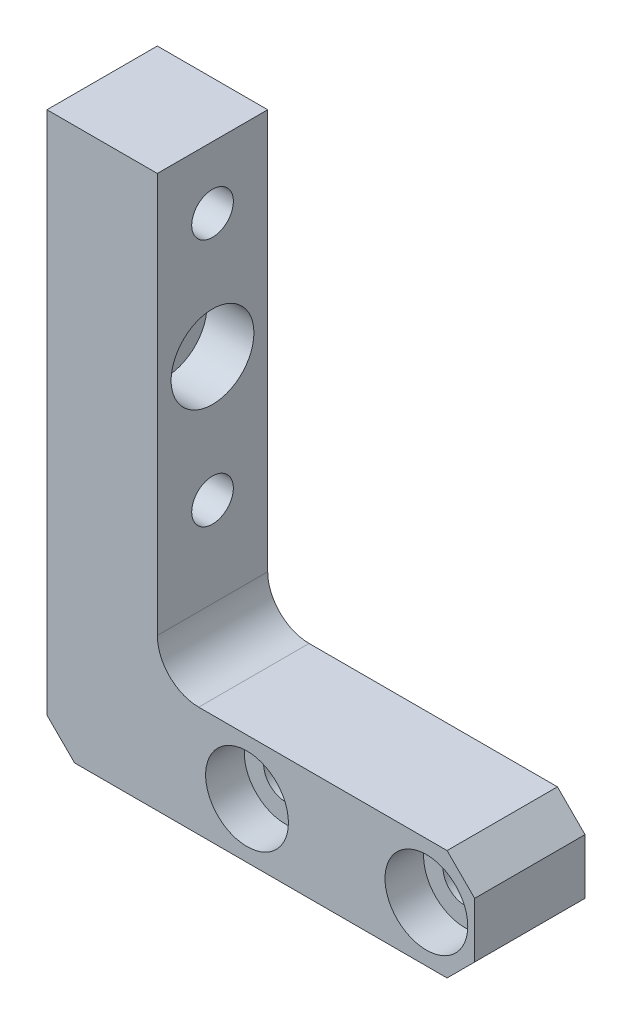
ISO-10303-21;
HEADER;
FILE_DESCRIPTION(('STEP AP214'),'2;1');
FILE_NAME('part.step','',(''),(''),'','','');
FILE_SCHEMA(('AUTOMOTIVE_DESIGN { 1 0 10303 214 1 1 1 1 }'));
ENDSEC;
DATA;
#1=APPLICATION_CONTEXT('core data for automotive mechanical design processes');
#2=APPLICATION_PROTOCOL_DEFINITION('international standard','automotive_design',2000,#1);
#3=PRODUCT_CONTEXT('',#1,'mechanical');
#4=PRODUCT('Part','Part','',(#3));
#5=PRODUCT_RELATED_PRODUCT_CATEGORY('part','',(#4));
#6=PRODUCT_DEFINITION_FORMATION('','',#4);
#7=PRODUCT_DEFINITION_CONTEXT('part definition',#1,'design');
#8=PRODUCT_DEFINITION('design','',#6,#7);
#9=PRODUCT_DEFINITION_SHAPE('','',#8);
#10=(LENGTH_UNIT() NAMED_UNIT(*) SI_UNIT(.MILLI.,.METRE.));
#11=(NAMED_UNIT(*) PLANE_ANGLE_UNIT() SI_UNIT($,.RADIAN.));
#12=(NAMED_UNIT(*) SI_UNIT($,.STERADIAN.) SOLID_ANGLE_UNIT());
#13=UNCERTAINTY_MEASURE_WITH_UNIT(LENGTH_MEASURE(1.E-05),#10,'distance_accuracy_value','');
#14=(GEOMETRIC_REPRESENTATION_CONTEXT(3) GLOBAL_UNCERTAINTY_ASSIGNED_CONTEXT((#13)) GLOBAL_UNIT_ASSIGNED_CONTEXT((#10,
#11,#12)) REPRESENTATION_CONTEXT('',''));
#15=CARTESIAN_POINT('',(0.,0.,0.));
#16=DIRECTION('',(0.,0.,1.));
#17=DIRECTION('',(1.,0.,0.));
#18=AXIS2_PLACEMENT_3D('',#15,#16,#17);
#19=CARTESIAN_POINT('',(-10.9,8.1,4.));
#20=DIRECTION('',(-1.,0.,0.));
#21=DIRECTION('',(0.,0.,1.));
#22=AXIS2_PLACEMENT_3D('',#19,#20,#21);
#23=PLANE('',#22);
#24=CARTESIAN_POINT('',(-10.9,6.49999999999999,4.));
#25=DIRECTION('',(1.,0.,0.));
#26=DIRECTION('',(0.,0.,-1.));
#27=AXIS2_PLACEMENT_3D('',#24,#25,#26);
#28=CIRCLE('',#27,3.);
#29=CARTESIAN_POINT('',(-10.9,6.49999999999999,1.));
#30=VERTEX_POINT('',#29);
#31=EDGE_CURVE('E195',#30,#30,#28,.T.);
#32=ORIENTED_EDGE('',*,*,#31,.T.);
#33=EDGE_LOOP('',(#32));
#34=FACE_BOUND('',#33,.T.);
#35=CARTESIAN_POINT('',(-10.9,6.49999999999999,4.));
#36=DIRECTION('',(1.,0.,0.));
#37=DIRECTION('',(0.,0.,-1.));
#38=AXIS2_PLACEMENT_3D('',#35,#36,#37);
#39=CIRCLE('',#38,1.6);
#40=CARTESIAN_POINT('',(-10.9,6.49999999999999,2.4));
#41=VERTEX_POINT('',#40);
#42=EDGE_CURVE('E192',#41,#41,#39,.F.);
#43=ORIENTED_EDGE('',*,*,#42,.T.);
#44=EDGE_LOOP('',(#43));
#45=FACE_BOUND('',#44,.T.);
#46=ADVANCED_FACE('F16',(#34,#45),#23,.F.);
#47=CARTESIAN_POINT('',(-1.,-16.,8.));
#48=DIRECTION('',(0.,0.,1.));
#49=DIRECTION('',(1.,0.,0.));
#50=AXIS2_PLACEMENT_3D('',#47,#48,#49);
#51=CYLINDRICAL_SURFACE('',#50,3.);
#52=CARTESIAN_POINT('',(-1.,-16.,8.));
#53=DIRECTION('',(0.,0.,1.));
#54=DIRECTION('',(1.,0.,0.));
#55=AXIS2_PLACEMENT_3D('',#52,#53,#54);
#56=CIRCLE('',#55,3.);
#57=CARTESIAN_POINT('',(2.,-16.,8.));
#58=VERTEX_POINT('',#57);
#59=EDGE_CURVE('E189',#58,#58,#56,.F.);
#60=ORIENTED_EDGE('',*,*,#59,.F.);
#61=EDGE_LOOP('',(#60));
#62=FACE_BOUND('',#61,.T.);
#63=CARTESIAN_POINT('',(-1.,-16.,5.2));
#64=DIRECTION('',(0.,0.,1.));
#65=DIRECTION('',(1.,0.,0.));
#66=AXIS2_PLACEMENT_3D('',#63,#64,#65);
#67=CIRCLE('',#66,3.);
#68=CARTESIAN_POINT('',(2.,-16.,5.2));
#69=VERTEX_POINT('',#68);
#70=EDGE_CURVE('E19',#69,#69,#67,.F.);
#71=ORIENTED_EDGE('',*,*,#70,.T.);
#72=EDGE_LOOP('',(#71));
#73=FACE_BOUND('',#72,.T.);
#74=ADVANCED_FACE('F204',(#62,#73),#51,.F.);
#75=CARTESIAN_POINT('',(12.,-16.,8.));
#76=DIRECTION('',(0.,0.,1.));
#77=DIRECTION('',(1.,0.,0.));
#78=AXIS2_PLACEMENT_3D('',#75,#76,#77);
#79=CYLINDRICAL_SURFACE('',#78,3.);
#80=CARTESIAN_POINT('',(12.,-16.,8.));
#81=DIRECTION('',(0.,0.,1.));
#82=DIRECTION('',(1.,0.,0.));
#83=AXIS2_PLACEMENT_3D('',#80,#81,#82);
#84=CIRCLE('',#83,3.);
#85=CARTESIAN_POINT('',(15.,-16.,8.));
#86=VERTEX_POINT('',#85);
#87=EDGE_CURVE('E186',#86,#86,#84,.F.);
#88=ORIENTED_EDGE('',*,*,#87,.F.);
#89=EDGE_LOOP('',(#88));
#90=FACE_BOUND('',#89,.T.);
#91=CARTESIAN_POINT('',(12.,-16.,5.2));
#92=DIRECTION('',(0.,0.,1.));
#93=DIRECTION('',(1.,0.,0.));
#94=AXIS2_PLACEMENT_3D('',#91,#92,#93);
#95=CIRCLE('',#94,3.);
#96=CARTESIAN_POINT('',(15.,-16.,5.2));
#97=VERTEX_POINT('',#96);
#98=EDGE_CURVE('E197',#97,#97,#95,.F.);
#99=ORIENTED_EDGE('',*,*,#98,.T.);
#100=EDGE_LOOP('',(#99));
#101=FACE_BOUND('',#100,.T.);
#102=ADVANCED_FACE('F210',(#90,#101),#79,.F.);
#103=CARTESIAN_POINT('',(0.600000000000003,-16.,5.2));
#104=DIRECTION('',(0.,0.,-1.));
#105=DIRECTION('',(-1.,0.,0.));
#106=AXIS2_PLACEMENT_3D('',#103,#104,#105);
#107=PLANE('',#106);
#108=ORIENTED_EDGE('',*,*,#70,.F.);
#109=EDGE_LOOP('',(#108));
#110=FACE_BOUND('',#109,.T.);
#111=CARTESIAN_POINT('',(-1.,-16.,5.2));
#112=DIRECTION('',(0.,0.,1.));
#113=DIRECTION('',(1.,0.,0.));
#114=AXIS2_PLACEMENT_3D('',#111,#112,#113);
#115=CIRCLE('',#114,1.6);
#116=CARTESIAN_POINT('',(0.599999999999999,-16.,5.2));
#117=VERTEX_POINT('',#116);
#118=EDGE_CURVE('E183',#117,#117,#115,.F.);
#119=ORIENTED_EDGE('',*,*,#118,.T.);
#120=EDGE_LOOP('',(#119));
#121=FACE_BOUND('',#120,.T.);
#122=ADVANCED_FACE('F206',(#110,#121),#107,.F.);
#123=CARTESIAN_POINT('',(13.6,-16.,5.2));
#124=DIRECTION('',(0.,0.,-1.));
#125=DIRECTION('',(-1.,0.,0.));
#126=AXIS2_PLACEMENT_3D('',#123,#124,#125);
#127=PLANE('',#126);
#128=ORIENTED_EDGE('',*,*,#98,.F.);
#129=EDGE_LOOP('',(#128));
#130=FACE_BOUND('',#129,.T.);
#131=CARTESIAN_POINT('',(12.,-16.,5.2));
#132=DIRECTION('',(0.,0.,1.));
#133=DIRECTION('',(1.,0.,0.));
#134=AXIS2_PLACEMENT_3D('',#131,#132,#133);
#135=CIRCLE('',#134,1.6);
#136=CARTESIAN_POINT('',(13.6,-16.,5.2));
#137=VERTEX_POINT('',#136);
#138=EDGE_CURVE('E101',#137,#137,#135,.F.);
#139=ORIENTED_EDGE('',*,*,#138,.T.);
#140=EDGE_LOOP('',(#139));
#141=FACE_BOUND('',#140,.T.);
#142=ADVANCED_FACE('F209',(#130,#141),#127,.F.);
#143=CARTESIAN_POINT('',(-7.5,6.49999999999999,4.));
#144=DIRECTION('',(1.,0.,0.));
#145=DIRECTION('',(0.,0.,-1.));
#146=AXIS2_PLACEMENT_3D('',#143,#144,#145);
#147=CYLINDRICAL_SURFACE('',#146,3.);
#148=ORIENTED_EDGE('',*,*,#31,.F.);
#149=EDGE_LOOP('',(#148));
#150=FACE_BOUND('',#149,.T.);
#151=CARTESIAN_POINT('',(-7.5,6.49999999999999,4.));
#152=DIRECTION('',(1.,0.,0.));
#153=DIRECTION('',(0.,0.,-1.));
#154=AXIS2_PLACEMENT_3D('',#151,#152,#153);
#155=CIRCLE('',#154,3.);
#156=CARTESIAN_POINT('',(-7.5,6.49999999999999,1.));
#157=VERTEX_POINT('',#156);
#158=EDGE_CURVE('E173',#157,#157,#155,.T.);
#159=ORIENTED_EDGE('',*,*,#158,.T.);
#160=EDGE_LOOP('',(#159));
#161=FACE_BOUND('',#160,.T.);
#162=ADVANCED_FACE('F382',(#150,#161),#147,.F.);
#163=CARTESIAN_POINT('',(-15.5,15.5,4.));
#164=DIRECTION('',(-1.,0.,0.));
#165=DIRECTION('',(0.,0.,1.));
#166=AXIS2_PLACEMENT_3D('',#163,#164,#165);
#167=CYLINDRICAL_SURFACE('',#166,1.51);
#168=CARTESIAN_POINT('',(-7.5,15.5,4.));
#169=DIRECTION('',(-1.,0.,0.));
#170=DIRECTION('',(0.,0.,1.));
#171=AXIS2_PLACEMENT_3D('',#168,#169,#170);
#172=CIRCLE('',#171,1.51);
#173=CARTESIAN_POINT('',(-7.5,15.5,5.51));
#174=VERTEX_POINT('',#173);
#175=EDGE_CURVE('E100',#174,#174,#172,.F.);
#176=ORIENTED_EDGE('',*,*,#175,.T.);
#177=EDGE_LOOP('',(#176));
#178=FACE_BOUND('',#177,.T.);
#179=CARTESIAN_POINT('',(-15.5,15.5,4.));
#180=DIRECTION('',(-1.,0.,0.));
#181=DIRECTION('',(0.,0.,1.));
#182=AXIS2_PLACEMENT_3D('',#179,#180,#181);
#183=CIRCLE('',#182,1.51);
#184=CARTESIAN_POINT('',(-15.5,15.5,5.51));
#185=VERTEX_POINT('',#184);
#186=EDGE_CURVE('E152',#185,#185,#183,.T.);
#187=ORIENTED_EDGE('',*,*,#186,.T.);
#188=EDGE_LOOP('',(#187));
#189=FACE_BOUND('',#188,.T.);
#190=ADVANCED_FACE('F373',(#178,#189),#167,.F.);
#191=CARTESIAN_POINT('',(-15.5,-2.5,4.));
#192=DIRECTION('',(-1.,0.,0.));
#193=DIRECTION('',(0.,0.,1.));
#194=AXIS2_PLACEMENT_3D('',#191,#192,#193);
#195=CYLINDRICAL_SURFACE('',#194,1.51);
#196=CARTESIAN_POINT('',(-7.5,-2.5,4.));
#197=DIRECTION('',(-1.,0.,0.));
#198=DIRECTION('',(0.,0.,1.));
#199=AXIS2_PLACEMENT_3D('',#196,#197,#198);
#200=CIRCLE('',#199,1.51);
#201=CARTESIAN_POINT('',(-7.5,-2.5,5.51));
#202=VERTEX_POINT('',#201);
#203=EDGE_CURVE('E176',#202,#202,#200,.F.);
#204=ORIENTED_EDGE('',*,*,#203,.T.);
#205=EDGE_LOOP('',(#204));
#206=FACE_BOUND('',#205,.T.);
#207=CARTESIAN_POINT('',(-15.5,-2.5,4.));
#208=DIRECTION('',(-1.,0.,0.));
#209=DIRECTION('',(0.,0.,1.));
#210=AXIS2_PLACEMENT_3D('',#207,#208,#209);
#211=CIRCLE('',#210,1.51);
#212=CARTESIAN_POINT('',(-15.5,-2.5,5.51));
#213=VERTEX_POINT('',#212);
#214=EDGE_CURVE('E168',#213,#213,#211,.T.);
#215=ORIENTED_EDGE('',*,*,#214,.T.);
#216=EDGE_LOOP('',(#215));
#217=FACE_BOUND('',#216,.T.);
#218=ADVANCED_FACE('F364',(#206,#217),#195,.F.);
#219=CARTESIAN_POINT('',(-7.5,6.49999999999999,4.));
#220=DIRECTION('',(1.,0.,0.));
#221=DIRECTION('',(0.,0.,-1.));
#222=AXIS2_PLACEMENT_3D('',#219,#220,#221);
#223=CYLINDRICAL_SURFACE('',#222,1.6);
#224=CARTESIAN_POINT('',(-15.5,6.49999999999999,4.));
#225=DIRECTION('',(1.,0.,0.));
#226=DIRECTION('',(0.,0.,-1.));
#227=AXIS2_PLACEMENT_3D('',#224,#225,#226);
#228=CIRCLE('',#227,1.6);
#229=CARTESIAN_POINT('',(-15.5,6.49999999999999,2.4));
#230=VERTEX_POINT('',#229);
#231=EDGE_CURVE('E165',#230,#230,#228,.F.);
#232=ORIENTED_EDGE('',*,*,#231,.T.);
#233=EDGE_LOOP('',(#232));
#234=FACE_BOUND('',#233,.T.);
#235=ORIENTED_EDGE('',*,*,#42,.F.);
#236=EDGE_LOOP('',(#235));
#237=FACE_BOUND('',#236,.T.);
#238=ADVANCED_FACE('F226',(#234,#237),#223,.F.);
#239=CARTESIAN_POINT('',(0.,0.,8.));
#240=DIRECTION('',(0.,0.,1.));
#241=DIRECTION('',(1.,0.,0.));
#242=AXIS2_PLACEMENT_3D('',#239,#240,#241);
#243=PLANE('',#242);
#244=DIRECTION('',(1.,0.,0.));
#245=VECTOR('',#244,1.);
#246=CARTESIAN_POINT('',(-15.5,-20.,8.));
#247=LINE('',#246,#245);
#248=CARTESIAN_POINT('',(-13.5,-20.,8.));
#249=VERTEX_POINT('',#248);
#250=CARTESIAN_POINT('',(13.5,-20.,8.));
#251=VERTEX_POINT('',#250);
#252=EDGE_CURVE('E135',#249,#251,#247,.T.);
#253=ORIENTED_EDGE('',*,*,#252,.T.);
#254=DIRECTION('',(-0.707106781186549,-0.707106781186546,0.));
#255=VECTOR('',#254,1.);
#256=CARTESIAN_POINT('',(15.5,-18.,8.));
#257=LINE('',#256,#255);
#258=CARTESIAN_POINT('',(15.5,-18.,8.));
#259=VERTEX_POINT('',#258);
#260=EDGE_CURVE('E130',#251,#259,#257,.F.);
#261=ORIENTED_EDGE('',*,*,#260,.T.);
#262=DIRECTION('',(0.,1.,0.));
#263=VECTOR('',#262,1.);
#264=CARTESIAN_POINT('',(15.5,20.,8.));
#265=LINE('',#264,#263);
#266=CARTESIAN_POINT('',(15.5,-14.,8.));
#267=VERTEX_POINT('',#266);
#268=EDGE_CURVE('E125',#259,#267,#265,.T.);
#269=ORIENTED_EDGE('',*,*,#268,.T.);
#270=DIRECTION('',(0.707106781186549,-0.707106781186546,0.));
#271=VECTOR('',#270,1.);
#272=CARTESIAN_POINT('',(15.5,-14.,8.));
#273=LINE('',#272,#271);
#274=CARTESIAN_POINT('',(13.5,-12.,8.));
#275=VERTEX_POINT('',#274);
#276=EDGE_CURVE('E105',#267,#275,#273,.F.);
#277=ORIENTED_EDGE('',*,*,#276,.T.);
#278=DIRECTION('',(1.,0.,0.));
#279=VECTOR('',#278,1.);
#280=CARTESIAN_POINT('',(15.5,-12.,8.));
#281=LINE('',#280,#279);
#282=CARTESIAN_POINT('',(-4.5,-12.,8.));
#283=VERTEX_POINT('',#282);
#284=EDGE_CURVE('E104',#275,#283,#281,.F.);
#285=ORIENTED_EDGE('',*,*,#284,.T.);
#286=CARTESIAN_POINT('',(-4.5,-9.00000000000001,8.));
#287=DIRECTION('',(0.,0.,-1.));
#288=DIRECTION('',(-1.,0.,0.));
#289=AXIS2_PLACEMENT_3D('',#286,#287,#288);
#290=CIRCLE('',#289,3.);
#291=CARTESIAN_POINT('',(-7.5,-9.00000000000001,8.));
#292=VERTEX_POINT('',#291);
#293=EDGE_CURVE('E91',#283,#292,#290,.T.);
#294=ORIENTED_EDGE('',*,*,#293,.T.);
#295=DIRECTION('',(0.,-1.,0.));
#296=VECTOR('',#295,1.);
#297=CARTESIAN_POINT('',(-7.5,20.,8.));
#298=LINE('',#297,#296);
#299=CARTESIAN_POINT('',(-7.5,20.,8.));
#300=VERTEX_POINT('',#299);
#301=EDGE_CURVE('E156',#292,#300,#298,.F.);
#302=ORIENTED_EDGE('',*,*,#301,.T.);
#303=DIRECTION('',(1.,0.,0.));
#304=VECTOR('',#303,1.);
#305=CARTESIAN_POINT('',(-15.5,20.,8.));
#306=LINE('',#305,#304);
#307=CARTESIAN_POINT('',(-15.5,20.,8.));
#308=VERTEX_POINT('',#307);
#309=EDGE_CURVE('E150',#300,#308,#306,.F.);
#310=ORIENTED_EDGE('',*,*,#309,.T.);
#311=DIRECTION('',(0.,1.,0.));
#312=VECTOR('',#311,1.);
#313=CARTESIAN_POINT('',(-15.5,20.,8.));
#314=LINE('',#313,#312);
#315=CARTESIAN_POINT('',(-15.5,-18.,8.));
#316=VERTEX_POINT('',#315);
#317=EDGE_CURVE('E145',#308,#316,#314,.F.);
#318=ORIENTED_EDGE('',*,*,#317,.T.);
#319=DIRECTION('',(-0.707106781186546,0.707106781186549,0.));
#320=VECTOR('',#319,1.);
#321=CARTESIAN_POINT('',(-13.5,-20.,8.));
#322=LINE('',#321,#320);
#323=EDGE_CURVE('E140',#316,#249,#322,.F.);
#324=ORIENTED_EDGE('',*,*,#323,.T.);
#325=EDGE_LOOP('',(#253,#261,#269,#277,#285,#294,#302,#310,#318,#324));
#326=FACE_BOUND('',#325,.T.);
#327=ORIENTED_EDGE('',*,*,#87,.T.);
#328=EDGE_LOOP('',(#327));
#329=FACE_BOUND('',#328,.T.);
#330=ORIENTED_EDGE('',*,*,#59,.T.);
#331=EDGE_LOOP('',(#330));
#332=FACE_BOUND('',#331,.T.);
#333=ADVANCED_FACE('F107',(#326,#329,#332),#243,.T.);
#334=CARTESIAN_POINT('',(-1.,-16.,8.));
#335=DIRECTION('',(0.,0.,1.));
#336=DIRECTION('',(1.,0.,0.));
#337=AXIS2_PLACEMENT_3D('',#334,#335,#336);
#338=CYLINDRICAL_SURFACE('',#337,1.6);
#339=CARTESIAN_POINT('',(-1.,-16.,0.));
#340=DIRECTION('',(0.,0.,1.));
#341=DIRECTION('',(1.,0.,0.));
#342=AXIS2_PLACEMENT_3D('',#339,#340,#341);
#343=CIRCLE('',#342,1.6);
#344=CARTESIAN_POINT('',(0.599999999999999,-16.,0.));
#345=VERTEX_POINT('',#344);
#346=EDGE_CURVE('E110',#345,#345,#343,.F.);
#347=ORIENTED_EDGE('',*,*,#346,.T.);
#348=EDGE_LOOP('',(#347));
#349=FACE_BOUND('',#348,.T.);
#350=ORIENTED_EDGE('',*,*,#118,.F.);
#351=EDGE_LOOP('',(#350));
#352=FACE_BOUND('',#351,.T.);
#353=ADVANCED_FACE('F214',(#349,#352),#338,.F.);
#354=CARTESIAN_POINT('',(12.,-16.,8.));
#355=DIRECTION('',(0.,0.,1.));
#356=DIRECTION('',(1.,0.,0.));
#357=AXIS2_PLACEMENT_3D('',#354,#355,#356);
#358=CYLINDRICAL_SURFACE('',#357,1.6);
#359=CARTESIAN_POINT('',(12.,-16.,0.));
#360=DIRECTION('',(0.,0.,1.));
#361=DIRECTION('',(1.,0.,0.));
#362=AXIS2_PLACEMENT_3D('',#359,#360,#361);
#363=CIRCLE('',#362,1.6);
#364=CARTESIAN_POINT('',(13.6,-16.,0.));
#365=VERTEX_POINT('',#364);
#366=EDGE_CURVE('E113',#365,#365,#363,.F.);
#367=ORIENTED_EDGE('',*,*,#366,.T.);
#368=EDGE_LOOP('',(#367));
#369=FACE_BOUND('',#368,.T.);
#370=ORIENTED_EDGE('',*,*,#138,.F.);
#371=EDGE_LOOP('',(#370));
#372=FACE_BOUND('',#371,.T.);
#373=ADVANCED_FACE('F216',(#369,#372),#358,.F.);
#374=CARTESIAN_POINT('',(-4.5,-9.00000000000001,0.));
#375=DIRECTION('',(0.,0.,-1.));
#376=DIRECTION('',(-1.,0.,0.));
#377=AXIS2_PLACEMENT_3D('',#374,#375,#376);
#378=CYLINDRICAL_SURFACE('',#377,3.);
#379=DIRECTION('',(0.,0.,1.));
#380=VECTOR('',#379,1.);
#381=CARTESIAN_POINT('',(-7.5,-9.00000000000001,0.));
#382=LINE('',#381,#380);
#383=CARTESIAN_POINT('',(-7.5,-9.00000000000001,0.));
#384=VERTEX_POINT('',#383);
#385=EDGE_CURVE('E96',#384,#292,#382,.T.);
#386=ORIENTED_EDGE('',*,*,#385,.T.);
#387=ORIENTED_EDGE('',*,*,#293,.F.);
#388=DIRECTION('',(0.,0.,1.));
#389=VECTOR('',#388,1.);
#390=CARTESIAN_POINT('',(-4.5,-12.,0.));
#391=LINE('',#390,#389);
#392=CARTESIAN_POINT('',(-4.5,-12.,0.));
#393=VERTEX_POINT('',#392);
#394=EDGE_CURVE('E95',#283,#393,#391,.F.);
#395=ORIENTED_EDGE('',*,*,#394,.T.);
#396=CARTESIAN_POINT('',(-4.5,-9.00000000000001,0.));
#397=DIRECTION('',(0.,0.,-1.));
#398=DIRECTION('',(-1.,0.,0.));
#399=AXIS2_PLACEMENT_3D('',#396,#397,#398);
#400=CIRCLE('',#399,3.);
#401=EDGE_CURVE('E160',#393,#384,#400,.T.);
#402=ORIENTED_EDGE('',*,*,#401,.T.);
#403=EDGE_LOOP('',(#386,#387,#395,#402));
#404=FACE_BOUND('',#403,.T.);
#405=ADVANCED_FACE('F93',(#404),#378,.F.);
#406=CARTESIAN_POINT('',(-7.5,20.,0.));
#407=DIRECTION('',(-1.,0.,0.));
#408=DIRECTION('',(0.,-1.,0.));
#409=AXIS2_PLACEMENT_3D('',#406,#407,#408);
#410=PLANE('',#409);
#411=ORIENTED_EDGE('',*,*,#385,.F.);
#412=DIRECTION('',(0.,1.,0.));
#413=VECTOR('',#412,1.);
#414=CARTESIAN_POINT('',(-7.5,0.,0.));
#415=LINE('',#414,#413);
#416=CARTESIAN_POINT('',(-7.5,20.,0.));
#417=VERTEX_POINT('',#416);
#418=EDGE_CURVE('E162',#384,#417,#415,.T.);
#419=ORIENTED_EDGE('',*,*,#418,.T.);
#420=DIRECTION('',(0.,0.,-1.));
#421=VECTOR('',#420,1.);
#422=CARTESIAN_POINT('',(-7.5,20.,8.));
#423=LINE('',#422,#421);
#424=EDGE_CURVE('E153',#417,#300,#423,.F.);
#425=ORIENTED_EDGE('',*,*,#424,.T.);
#426=ORIENTED_EDGE('',*,*,#301,.F.);
#427=EDGE_LOOP('',(#411,#419,#425,#426));
#428=FACE_BOUND('',#427,.T.);
#429=ORIENTED_EDGE('',*,*,#158,.F.);
#430=EDGE_LOOP('',(#429));
#431=FACE_BOUND('',#430,.T.);
#432=ORIENTED_EDGE('',*,*,#203,.F.);
#433=EDGE_LOOP('',(#432));
#434=FACE_BOUND('',#433,.T.);
#435=ORIENTED_EDGE('',*,*,#175,.F.);
#436=EDGE_LOOP('',(#435));
#437=FACE_BOUND('',#436,.T.);
#438=ADVANCED_FACE('F266',(#428,#431,#434,#437),#410,.F.);
#439=CARTESIAN_POINT('',(-15.5,20.,8.));
#440=DIRECTION('',(0.,-1.,0.));
#441=DIRECTION('',(0.,0.,-1.));
#442=AXIS2_PLACEMENT_3D('',#439,#440,#441);
#443=PLANE('',#442);
#444=ORIENTED_EDGE('',*,*,#424,.F.);
#445=DIRECTION('',(1.,0.,0.));
#446=VECTOR('',#445,1.);
#447=CARTESIAN_POINT('',(0.,20.,0.));
#448=LINE('',#447,#446);
#449=CARTESIAN_POINT('',(-15.5,20.,0.));
#450=VERTEX_POINT('',#449);
#451=EDGE_CURVE('E500',#417,#450,#448,.F.);
#452=ORIENTED_EDGE('',*,*,#451,.T.);
#453=DIRECTION('',(0.,0.,1.));
#454=VECTOR('',#453,1.);
#455=CARTESIAN_POINT('',(-15.5,20.,8.));
#456=LINE('',#455,#454);
#457=EDGE_CURVE('E147',#450,#308,#456,.T.);
#458=ORIENTED_EDGE('',*,*,#457,.T.);
#459=ORIENTED_EDGE('',*,*,#309,.F.);
#460=EDGE_LOOP('',(#444,#452,#458,#459));
#461=FACE_BOUND('',#460,.T.);
#462=ADVANCED_FACE('F262',(#461),#443,.F.);
#463=CARTESIAN_POINT('',(-15.5,20.,8.));
#464=DIRECTION('',(1.,0.,0.));
#465=DIRECTION('',(0.,1.,0.));
#466=AXIS2_PLACEMENT_3D('',#463,#464,#465);
#467=PLANE('',#466);
#468=DIRECTION('',(0.,0.,1.));
#469=VECTOR('',#468,1.);
#470=CARTESIAN_POINT('',(-15.5,-18.,8.));
#471=LINE('',#470,#469);
#472=CARTESIAN_POINT('',(-15.5,-18.,0.));
#473=VERTEX_POINT('',#472);
#474=EDGE_CURVE('E142',#473,#316,#471,.T.);
#475=ORIENTED_EDGE('',*,*,#474,.T.);
#476=ORIENTED_EDGE('',*,*,#317,.F.);
#477=ORIENTED_EDGE('',*,*,#457,.F.);
#478=DIRECTION('',(0.,1.,0.));
#479=VECTOR('',#478,1.);
#480=CARTESIAN_POINT('',(-15.5,0.,0.));
#481=LINE('',#480,#479);
#482=EDGE_CURVE('E502',#450,#473,#481,.F.);
#483=ORIENTED_EDGE('',*,*,#482,.T.);
#484=EDGE_LOOP('',(#475,#476,#477,#483));
#485=FACE_BOUND('',#484,.T.);
#486=ORIENTED_EDGE('',*,*,#231,.F.);
#487=EDGE_LOOP('',(#486));
#488=FACE_BOUND('',#487,.T.);
#489=ORIENTED_EDGE('',*,*,#214,.F.);
#490=EDGE_LOOP('',(#489));
#491=FACE_BOUND('',#490,.T.);
#492=ORIENTED_EDGE('',*,*,#186,.F.);
#493=EDGE_LOOP('',(#492));
#494=FACE_BOUND('',#493,.T.);
#495=ADVANCED_FACE('F258',(#485,#488,#491,#494),#467,.F.);
#496=CARTESIAN_POINT('',(-13.5,-20.,8.));
#497=DIRECTION('',(0.707106781186549,0.707106781186546,0.));
#498=DIRECTION('',(-0.707106781186546,0.707106781186549,0.));
#499=AXIS2_PLACEMENT_3D('',#496,#497,#498);
#500=PLANE('',#499);
#501=ORIENTED_EDGE('',*,*,#474,.F.);
#502=DIRECTION('',(0.707106781186545,-0.70710678118655,0.));
#503=VECTOR('',#502,1.);
#504=CARTESIAN_POINT('',(-15.5,-18.,0.));
#505=LINE('',#504,#503);
#506=CARTESIAN_POINT('',(-13.5,-20.,0.));
#507=VERTEX_POINT('',#506);
#508=EDGE_CURVE('E540',#473,#507,#505,.T.);
#509=ORIENTED_EDGE('',*,*,#508,.T.);
#510=DIRECTION('',(0.,0.,1.));
#511=VECTOR('',#510,1.);
#512=CARTESIAN_POINT('',(-13.5,-20.,8.));
#513=LINE('',#512,#511);
#514=EDGE_CURVE('E137',#507,#249,#513,.T.);
#515=ORIENTED_EDGE('',*,*,#514,.T.);
#516=ORIENTED_EDGE('',*,*,#323,.F.);
#517=EDGE_LOOP('',(#501,#509,#515,#516));
#518=FACE_BOUND('',#517,.T.);
#519=ADVANCED_FACE('F254',(#518),#500,.F.);
#520=CARTESIAN_POINT('',(-15.5,-20.,8.));
#521=DIRECTION('',(0.,1.,0.));
#522=DIRECTION('',(0.,0.,1.));
#523=AXIS2_PLACEMENT_3D('',#520,#521,#522);
#524=PLANE('',#523);
#525=ORIENTED_EDGE('',*,*,#514,.F.);
#526=DIRECTION('',(1.,0.,0.));
#527=VECTOR('',#526,1.);
#528=CARTESIAN_POINT('',(0.,-20.,0.));
#529=LINE('',#528,#527);
#530=CARTESIAN_POINT('',(13.5,-20.,0.));
#531=VERTEX_POINT('',#530);
#532=EDGE_CURVE('E531',#507,#531,#529,.T.);
#533=ORIENTED_EDGE('',*,*,#532,.T.);
#534=DIRECTION('',(0.,0.,1.));
#535=VECTOR('',#534,1.);
#536=CARTESIAN_POINT('',(13.5,-20.,8.));
#537=LINE('',#536,#535);
#538=EDGE_CURVE('E132',#531,#251,#537,.T.);
#539=ORIENTED_EDGE('',*,*,#538,.T.);
#540=ORIENTED_EDGE('',*,*,#252,.F.);
#541=EDGE_LOOP('',(#525,#533,#539,#540));
#542=FACE_BOUND('',#541,.T.);
#543=ADVANCED_FACE('F250',(#542),#524,.F.);
#544=CARTESIAN_POINT('',(15.5,-18.,8.));
#545=DIRECTION('',(-0.707106781186546,0.707106781186549,0.));
#546=DIRECTION('',(-0.707106781186549,-0.707106781186546,0.));
#547=AXIS2_PLACEMENT_3D('',#544,#545,#546);
#548=PLANE('',#547);
#549=ORIENTED_EDGE('',*,*,#538,.F.);
#550=DIRECTION('',(0.707106781186547,0.707106781186547,0.));
#551=VECTOR('',#550,1.);
#552=CARTESIAN_POINT('',(13.5,-20.,0.));
#553=LINE('',#552,#551);
#554=CARTESIAN_POINT('',(15.5,-18.,0.));
#555=VERTEX_POINT('',#554);
#556=EDGE_CURVE('E522',#531,#555,#553,.T.);
#557=ORIENTED_EDGE('',*,*,#556,.T.);
#558=DIRECTION('',(0.,0.,1.));
#559=VECTOR('',#558,1.);
#560=CARTESIAN_POINT('',(15.5,-18.,8.));
#561=LINE('',#560,#559);
#562=EDGE_CURVE('E127',#555,#259,#561,.T.);
#563=ORIENTED_EDGE('',*,*,#562,.T.);
#564=ORIENTED_EDGE('',*,*,#260,.F.);
#565=EDGE_LOOP('',(#549,#557,#563,#564));
#566=FACE_BOUND('',#565,.T.);
#567=ADVANCED_FACE('F246',(#566),#548,.F.);
#568=CARTESIAN_POINT('',(15.5,20.,8.));
#569=DIRECTION('',(-1.,0.,0.));
#570=DIRECTION('',(0.,0.,1.));
#571=AXIS2_PLACEMENT_3D('',#568,#569,#570);
#572=PLANE('',#571);
#573=DIRECTION('',(0.,0.,1.));
#574=VECTOR('',#573,1.);
#575=CARTESIAN_POINT('',(15.5,-14.,8.));
#576=LINE('',#575,#574);
#577=CARTESIAN_POINT('',(15.5,-14.,0.));
#578=VERTEX_POINT('',#577);
#579=EDGE_CURVE('E122',#578,#267,#576,.T.);
#580=ORIENTED_EDGE('',*,*,#579,.T.);
#581=ORIENTED_EDGE('',*,*,#268,.F.);
#582=ORIENTED_EDGE('',*,*,#562,.F.);
#583=DIRECTION('',(0.,1.,0.));
#584=VECTOR('',#583,1.);
#585=CARTESIAN_POINT('',(15.5,0.,0.));
#586=LINE('',#585,#584);
#587=EDGE_CURVE('E513',#555,#578,#586,.T.);
#588=ORIENTED_EDGE('',*,*,#587,.T.);
#589=EDGE_LOOP('',(#580,#581,#582,#588));
#590=FACE_BOUND('',#589,.T.);
#591=ADVANCED_FACE('F242',(#590),#572,.F.);
#592=CARTESIAN_POINT('',(15.5,-14.,8.));
#593=DIRECTION('',(-0.707106781186546,-0.707106781186549,0.));
#594=DIRECTION('',(0.707106781186549,-0.707106781186546,0.));
#595=AXIS2_PLACEMENT_3D('',#592,#593,#594);
#596=PLANE('',#595);
#597=DIRECTION('',(0.,0.,1.));
#598=VECTOR('',#597,1.);
#599=CARTESIAN_POINT('',(13.5,-12.,0.));
#600=LINE('',#599,#598);
#601=CARTESIAN_POINT('',(13.5,-12.,0.));
#602=VERTEX_POINT('',#601);
#603=EDGE_CURVE('E33',#602,#275,#600,.T.);
#604=ORIENTED_EDGE('',*,*,#603,.T.);
#605=ORIENTED_EDGE('',*,*,#276,.F.);
#606=ORIENTED_EDGE('',*,*,#579,.F.);
#607=DIRECTION('',(-0.707106781186549,0.707106781186546,0.));
#608=VECTOR('',#607,1.);
#609=CARTESIAN_POINT('',(15.5,-14.,0.));
#610=LINE('',#609,#608);
#611=EDGE_CURVE('E25',#578,#602,#610,.T.);
#612=ORIENTED_EDGE('',*,*,#611,.T.);
#613=EDGE_LOOP('',(#604,#605,#606,#612));
#614=FACE_BOUND('',#613,.T.);
#615=ADVANCED_FACE('F235',(#614),#596,.F.);
#616=CARTESIAN_POINT('',(15.5,-12.,0.));
#617=DIRECTION('',(0.,-1.,0.));
#618=DIRECTION('',(1.,0.,0.));
#619=AXIS2_PLACEMENT_3D('',#616,#617,#618);
#620=PLANE('',#619);
#621=ORIENTED_EDGE('',*,*,#603,.F.);
#622=DIRECTION('',(1.,0.,0.));
#623=VECTOR('',#622,1.);
#624=CARTESIAN_POINT('',(0.,-12.,0.));
#625=LINE('',#624,#623);
#626=EDGE_CURVE('E11',#602,#393,#625,.F.);
#627=ORIENTED_EDGE('',*,*,#626,.T.);
#628=ORIENTED_EDGE('',*,*,#394,.F.);
#629=ORIENTED_EDGE('',*,*,#284,.F.);
#630=EDGE_LOOP('',(#621,#627,#628,#629));
#631=FACE_BOUND('',#630,.T.);
#632=ADVANCED_FACE('F103',(#631),#620,.F.);
#633=CARTESIAN_POINT('',(0.,0.,0.));
#634=DIRECTION('',(0.,0.,1.));
#635=DIRECTION('',(1.,0.,0.));
#636=AXIS2_PLACEMENT_3D('',#633,#634,#635);
#637=PLANE('',#636);
#638=ORIENTED_EDGE('',*,*,#611,.F.);
#639=ORIENTED_EDGE('',*,*,#587,.F.);
#640=ORIENTED_EDGE('',*,*,#556,.F.);
#641=ORIENTED_EDGE('',*,*,#532,.F.);
#642=ORIENTED_EDGE('',*,*,#508,.F.);
#643=ORIENTED_EDGE('',*,*,#482,.F.);
#644=ORIENTED_EDGE('',*,*,#451,.F.);
#645=ORIENTED_EDGE('',*,*,#418,.F.);
#646=ORIENTED_EDGE('',*,*,#401,.F.);
#647=ORIENTED_EDGE('',*,*,#626,.F.);
#648=EDGE_LOOP('',(#638,#639,#640,#641,#642,#643,#644,#645,#646,#647));
#649=FACE_BOUND('',#648,.T.);
#650=ORIENTED_EDGE('',*,*,#366,.F.);
#651=EDGE_LOOP('',(#650));
#652=FACE_BOUND('',#651,.T.);
#653=ORIENTED_EDGE('',*,*,#346,.F.);
#654=EDGE_LOOP('',(#653));
#655=FACE_BOUND('',#654,.T.);
#656=ADVANCED_FACE('F228',(#649,#652,#655),#637,.F.);
#657=CLOSED_SHELL('',(#46,#74,#102,#122,#142,#162,#190,#218,#238,#333,#353,#373,#405,#438,#462,
#495,#519,#543,#567,#591,#615,#632,#656));
#658=MANIFOLD_SOLID_BREP('B1',#657);
#659=ADVANCED_BREP_SHAPE_REPRESENTATION('',(#18,#658),#14);
#660=SHAPE_DEFINITION_REPRESENTATION(#9,#659);
ENDSEC;
END-ISO-10303-21;
